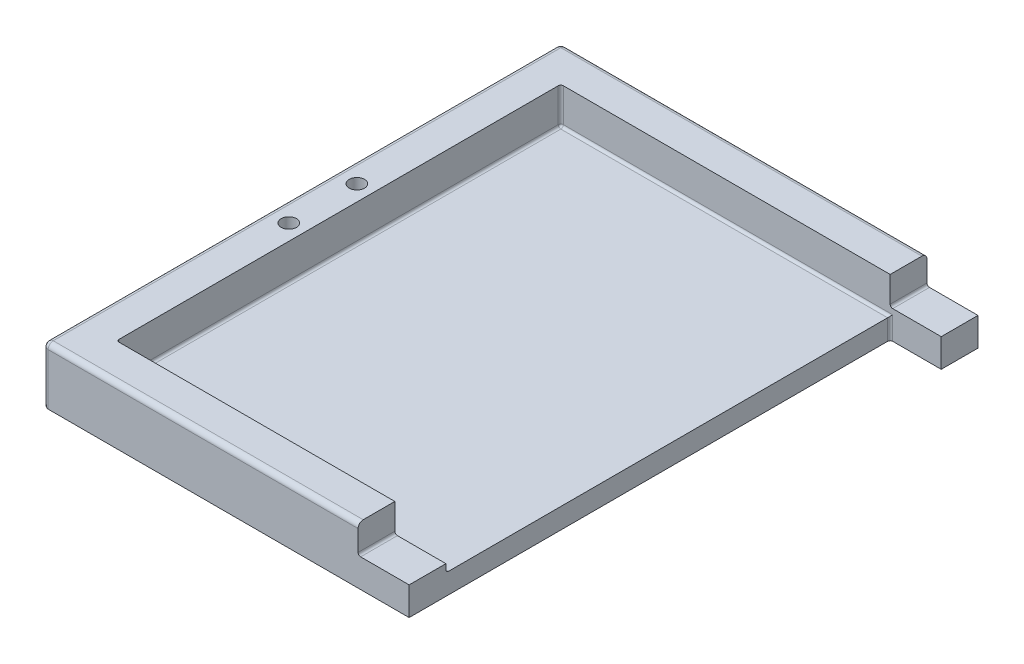
ISO-10303-21;
HEADER;
FILE_DESCRIPTION(('STEP AP214'),'2;1');
FILE_NAME('part.step','',(''),(''),'','','');
FILE_SCHEMA(('AUTOMOTIVE_DESIGN { 1 0 10303 214 1 1 1 1 }'));
ENDSEC;
DATA;
#1=APPLICATION_CONTEXT('core data for automotive mechanical design processes');
#2=APPLICATION_PROTOCOL_DEFINITION('international standard','automotive_design',2000,#1);
#3=PRODUCT_CONTEXT('',#1,'mechanical');
#4=PRODUCT('Part','Part','',(#3));
#5=PRODUCT_RELATED_PRODUCT_CATEGORY('part','',(#4));
#6=PRODUCT_DEFINITION_FORMATION('','',#4);
#7=PRODUCT_DEFINITION_CONTEXT('part definition',#1,'design');
#8=PRODUCT_DEFINITION('design','',#6,#7);
#9=PRODUCT_DEFINITION_SHAPE('','',#8);
#10=(LENGTH_UNIT() NAMED_UNIT(*) SI_UNIT(.MILLI.,.METRE.));
#11=(NAMED_UNIT(*) PLANE_ANGLE_UNIT() SI_UNIT($,.RADIAN.));
#12=(NAMED_UNIT(*) SI_UNIT($,.STERADIAN.) SOLID_ANGLE_UNIT());
#13=UNCERTAINTY_MEASURE_WITH_UNIT(LENGTH_MEASURE(1.E-05),#10,'distance_accuracy_value','');
#14=(GEOMETRIC_REPRESENTATION_CONTEXT(3) GLOBAL_UNCERTAINTY_ASSIGNED_CONTEXT((#13)) GLOBAL_UNIT_ASSIGNED_CONTEXT((#10,
#11,#12)) REPRESENTATION_CONTEXT('',''));
#15=CARTESIAN_POINT('',(0.,0.,0.));
#16=DIRECTION('',(0.,0.,1.));
#17=DIRECTION('',(1.,0.,0.));
#18=AXIS2_PLACEMENT_3D('',#15,#16,#17);
#19=CARTESIAN_POINT('',(35.85,11.1,-50.7));
#20=DIRECTION('',(1.,0.,0.));
#21=DIRECTION('',(0.,0.,-1.));
#22=AXIS2_PLACEMENT_3D('',#19,#20,#21);
#23=PLANE('',#22);
#24=DIRECTION('',(0.,0.,1.));
#25=VECTOR('',#24,1.);
#26=CARTESIAN_POINT('',(35.85,0.,-50.7));
#27=LINE('',#26,#25);
#28=CARTESIAN_POINT('',(35.85,0.,-43.));
#29=VERTEX_POINT('',#28);
#30=CARTESIAN_POINT('',(35.85,0.,50.7));
#31=VERTEX_POINT('',#30);
#32=EDGE_CURVE('E245',#29,#31,#27,.T.);
#33=ORIENTED_EDGE('',*,*,#32,.F.);
#34=DIRECTION('',(0.,-1.,0.));
#35=VECTOR('',#34,1.);
#36=CARTESIAN_POINT('',(35.85,11.1,-43.));
#37=LINE('',#36,#35);
#38=CARTESIAN_POINT('',(35.85,3.99999999999999,-43.));
#39=VERTEX_POINT('',#38);
#40=EDGE_CURVE('E249',#29,#39,#37,.F.);
#41=ORIENTED_EDGE('',*,*,#40,.T.);
#42=DIRECTION('',(0.,0.,-1.));
#43=VECTOR('',#42,1.);
#44=CARTESIAN_POINT('',(35.85,3.99999999999999,43.5));
#45=LINE('',#44,#43);
#46=CARTESIAN_POINT('',(35.85,3.99999999999999,43.));
#47=VERTEX_POINT('',#46);
#48=EDGE_CURVE('E239',#47,#39,#45,.T.);
#49=ORIENTED_EDGE('',*,*,#48,.F.);
#50=CARTESIAN_POINT('',(35.85,4.49999999999999,43.));
#51=DIRECTION('',(1.,0.,0.));
#52=DIRECTION('',(0.,0.,-1.));
#53=AXIS2_PLACEMENT_3D('',#50,#51,#52);
#54=CIRCLE('',#53,0.5);
#55=CARTESIAN_POINT('',(35.85,4.49999999999999,43.5));
#56=VERTEX_POINT('',#55);
#57=EDGE_CURVE('E12',#47,#56,#54,.F.);
#58=ORIENTED_EDGE('',*,*,#57,.T.);
#59=DIRECTION('',(0.,-1.,0.));
#60=VECTOR('',#59,1.);
#61=CARTESIAN_POINT('',(35.85,18.4615904387453,43.5));
#62=LINE('',#61,#60);
#63=CARTESIAN_POINT('',(35.85,5.55,43.5));
#64=VERTEX_POINT('',#63);
#65=EDGE_CURVE('E243',#64,#56,#62,.T.);
#66=ORIENTED_EDGE('',*,*,#65,.F.);
#67=DIRECTION('',(0.,0.,-1.));
#68=VECTOR('',#67,1.);
#69=CARTESIAN_POINT('',(35.85,5.55,52.2249307649503));
#70=LINE('',#69,#68);
#71=CARTESIAN_POINT('',(35.85,5.55,50.7));
#72=VERTEX_POINT('',#71);
#73=EDGE_CURVE('E220',#72,#64,#70,.T.);
#74=ORIENTED_EDGE('',*,*,#73,.F.);
#75=DIRECTION('',(0.,-1.,0.));
#76=VECTOR('',#75,1.);
#77=CARTESIAN_POINT('',(35.85,11.1,50.7));
#78=LINE('',#77,#76);
#79=EDGE_CURVE('E259',#72,#31,#78,.T.);
#80=ORIENTED_EDGE('',*,*,#79,.T.);
#81=EDGE_LOOP('',(#33,#41,#49,#58,#66,#74,#80));
#82=FACE_BOUND('',#81,.T.);
#83=ADVANCED_FACE('F36',(#82),#23,.T.);
#84=CARTESIAN_POINT('',(0.,11.1,0.));
#85=DIRECTION('',(0.,1.,0.));
#86=DIRECTION('',(0.,0.,1.));
#87=AXIS2_PLACEMENT_3D('',#84,#85,#86);
#88=PLANE('',#87);
#89=CARTESIAN_POINT('',(-31.75,11.1,-6.65790951));
#90=DIRECTION('',(0.,1.,0.));
#91=DIRECTION('',(0.,0.,-1.));
#92=AXIS2_PLACEMENT_3D('',#89,#90,#91);
#93=CIRCLE('',#92,1.5);
#94=CARTESIAN_POINT('',(-31.75,11.1,-8.15790951));
#95=VERTEX_POINT('',#94);
#96=EDGE_CURVE('E285',#95,#95,#93,.T.);
#97=ORIENTED_EDGE('',*,*,#96,.F.);
#98=EDGE_LOOP('',(#97));
#99=FACE_BOUND('',#98,.T.);
#100=CARTESIAN_POINT('',(-31.75,11.1,6.65790951));
#101=DIRECTION('',(0.,1.,0.));
#102=DIRECTION('',(0.,0.,1.));
#103=AXIS2_PLACEMENT_3D('',#100,#101,#102);
#104=CIRCLE('',#103,1.5);
#105=CARTESIAN_POINT('',(-31.75,11.1,8.15790951));
#106=VERTEX_POINT('',#105);
#107=EDGE_CURVE('E289',#106,#106,#104,.T.);
#108=ORIENTED_EDGE('',*,*,#107,.F.);
#109=EDGE_LOOP('',(#108));
#110=FACE_BOUND('',#109,.T.);
#111=DIRECTION('',(1.,0.,0.));
#112=VECTOR('',#111,1.);
#113=CARTESIAN_POINT('',(35.85,11.1,49.7));
#114=LINE('',#113,#112);
#115=CARTESIAN_POINT('',(-34.85,11.1,49.7));
#116=VERTEX_POINT('',#115);
#117=CARTESIAN_POINT('',(25.85,11.1,49.7));
#118=VERTEX_POINT('',#117);
#119=EDGE_CURVE('E409',#116,#118,#114,.T.);
#120=ORIENTED_EDGE('',*,*,#119,.T.);
#121=DIRECTION('',(0.,0.,1.));
#122=VECTOR('',#121,1.);
#123=CARTESIAN_POINT('',(25.85,11.1,43.5));
#124=LINE('',#123,#122);
#125=CARTESIAN_POINT('',(25.85,11.1,43.5));
#126=VERTEX_POINT('',#125);
#127=EDGE_CURVE('E224',#126,#118,#124,.T.);
#128=ORIENTED_EDGE('',*,*,#127,.F.);
#129=DIRECTION('',(1.,0.,0.));
#130=VECTOR('',#129,1.);
#131=CARTESIAN_POINT('',(0.,11.1,43.5));
#132=LINE('',#131,#130);
#133=CARTESIAN_POINT('',(-28.15,11.1,43.5));
#134=VERTEX_POINT('',#133);
#135=EDGE_CURVE('E392',#134,#126,#132,.T.);
#136=ORIENTED_EDGE('',*,*,#135,.F.);
#137=CARTESIAN_POINT('',(-28.15,11.1,43.));
#138=DIRECTION('',(0.,1.,0.));
#139=DIRECTION('',(0.,0.,1.));
#140=AXIS2_PLACEMENT_3D('',#137,#138,#139);
#141=CIRCLE('',#140,0.5);
#142=CARTESIAN_POINT('',(-28.65,11.1,43.));
#143=VERTEX_POINT('',#142);
#144=EDGE_CURVE('E45',#134,#143,#141,.F.);
#145=ORIENTED_EDGE('',*,*,#144,.T.);
#146=DIRECTION('',(0.,0.,1.));
#147=VECTOR('',#146,1.);
#148=CARTESIAN_POINT('',(-28.65,11.1,0.));
#149=LINE('',#148,#147);
#150=CARTESIAN_POINT('',(-28.65,11.1,-43.));
#151=VERTEX_POINT('',#150);
#152=EDGE_CURVE('E384',#151,#143,#149,.T.);
#153=ORIENTED_EDGE('',*,*,#152,.F.);
#154=CARTESIAN_POINT('',(-28.15,11.1,-43.));
#155=DIRECTION('',(0.,1.,0.));
#156=DIRECTION('',(0.,0.,1.));
#157=AXIS2_PLACEMENT_3D('',#154,#155,#156);
#158=CIRCLE('',#157,0.5);
#159=CARTESIAN_POINT('',(-28.15,11.1,-43.5));
#160=VERTEX_POINT('',#159);
#161=EDGE_CURVE('E344',#151,#160,#158,.F.);
#162=ORIENTED_EDGE('',*,*,#161,.T.);
#163=DIRECTION('',(-1.,0.,0.));
#164=VECTOR('',#163,1.);
#165=CARTESIAN_POINT('',(0.,11.1,-43.5));
#166=LINE('',#165,#164);
#167=CARTESIAN_POINT('',(35.85,11.1,-43.5));
#168=VERTEX_POINT('',#167);
#169=EDGE_CURVE('E393',#168,#160,#166,.T.);
#170=ORIENTED_EDGE('',*,*,#169,.F.);
#171=DIRECTION('',(0.,0.,1.));
#172=VECTOR('',#171,1.);
#173=CARTESIAN_POINT('',(35.85,11.1,-50.7));
#174=LINE('',#173,#172);
#175=CARTESIAN_POINT('',(35.85,11.1,-49.7));
#176=VERTEX_POINT('',#175);
#177=EDGE_CURVE('E256',#176,#168,#174,.T.);
#178=ORIENTED_EDGE('',*,*,#177,.F.);
#179=DIRECTION('',(1.,0.,0.));
#180=VECTOR('',#179,1.);
#181=CARTESIAN_POINT('',(0.,11.1,-49.7));
#182=LINE('',#181,#180);
#183=CARTESIAN_POINT('',(-34.85,11.1,-49.7));
#184=VERTEX_POINT('',#183);
#185=EDGE_CURVE('E413',#176,#184,#182,.F.);
#186=ORIENTED_EDGE('',*,*,#185,.T.);
#187=DIRECTION('',(0.,0.,1.));
#188=VECTOR('',#187,1.);
#189=CARTESIAN_POINT('',(-34.85,11.1,50.7));
#190=LINE('',#189,#188);
#191=EDGE_CURVE('E411',#184,#116,#190,.T.);
#192=ORIENTED_EDGE('',*,*,#191,.T.);
#193=EDGE_LOOP('',(#120,#128,#136,#145,#153,#162,#170,#178,#186,#192));
#194=FACE_BOUND('',#193,.T.);
#195=ADVANCED_FACE('F388',(#99,#110,#194),#88,.T.);
#196=CARTESIAN_POINT('',(0.,10.1,49.7));
#197=DIRECTION('',(-1.,0.,0.));
#198=DIRECTION('',(0.,0.,1.));
#199=AXIS2_PLACEMENT_3D('',#196,#197,#198);
#200=CYLINDRICAL_SURFACE('',#199,1.);
#201=DIRECTION('',(1.,0.,0.));
#202=VECTOR('',#201,1.);
#203=CARTESIAN_POINT('',(-35.85,10.1,50.7));
#204=LINE('',#203,#202);
#205=CARTESIAN_POINT('',(25.85,10.1,50.7));
#206=VERTEX_POINT('',#205);
#207=CARTESIAN_POINT('',(-34.85,10.1,50.7));
#208=VERTEX_POINT('',#207);
#209=EDGE_CURVE('E423',#206,#208,#204,.F.);
#210=ORIENTED_EDGE('',*,*,#209,.F.);
#211=CARTESIAN_POINT('',(25.85,10.1,49.7));
#212=DIRECTION('',(1.,0.,0.));
#213=DIRECTION('',(0.,0.,-1.));
#214=AXIS2_PLACEMENT_3D('',#211,#212,#213);
#215=CIRCLE('',#214,1.);
#216=EDGE_CURVE('E266',#206,#118,#215,.F.);
#217=ORIENTED_EDGE('',*,*,#216,.T.);
#218=ORIENTED_EDGE('',*,*,#119,.F.);
#219=CARTESIAN_POINT('',(-34.85,10.1,49.7));
#220=DIRECTION('',(-1.,0.,0.));
#221=DIRECTION('',(0.,0.,1.));
#222=AXIS2_PLACEMENT_3D('',#219,#220,#221);
#223=CIRCLE('',#222,1.);
#224=EDGE_CURVE('E434',#208,#116,#223,.T.);
#225=ORIENTED_EDGE('',*,*,#224,.F.);
#226=EDGE_LOOP('',(#210,#217,#218,#225));
#227=FACE_BOUND('',#226,.T.);
#228=ADVANCED_FACE('F472',(#227),#200,.T.);
#229=CARTESIAN_POINT('',(-35.85,11.1,-50.7));
#230=DIRECTION('',(1.,0.,0.));
#231=DIRECTION('',(0.,0.,-1.));
#232=AXIS2_PLACEMENT_3D('',#229,#230,#231);
#233=PLANE('',#232);
#234=DIRECTION('',(0.,0.,1.));
#235=VECTOR('',#234,1.);
#236=CARTESIAN_POINT('',(-35.85,10.1,-50.7));
#237=LINE('',#236,#235);
#238=CARTESIAN_POINT('',(-35.85,10.1,49.7));
#239=VERTEX_POINT('',#238);
#240=CARTESIAN_POINT('',(-35.85,10.1,-49.7));
#241=VERTEX_POINT('',#240);
#242=EDGE_CURVE('E400',#239,#241,#237,.F.);
#243=ORIENTED_EDGE('',*,*,#242,.T.);
#244=DIRECTION('',(0.,-1.,0.));
#245=VECTOR('',#244,1.);
#246=CARTESIAN_POINT('',(-35.85,0.,-49.7));
#247=LINE('',#246,#245);
#248=CARTESIAN_POINT('',(-35.85,0.999999999999999,-49.7));
#249=VERTEX_POINT('',#248);
#250=EDGE_CURVE('E405',#241,#249,#247,.T.);
#251=ORIENTED_EDGE('',*,*,#250,.T.);
#252=DIRECTION('',(0.,0.,1.));
#253=VECTOR('',#252,1.);
#254=CARTESIAN_POINT('',(-35.85,0.999999999999999,-50.7));
#255=LINE('',#254,#253);
#256=CARTESIAN_POINT('',(-35.85,0.999999999999999,49.7));
#257=VERTEX_POINT('',#256);
#258=EDGE_CURVE('E402',#249,#257,#255,.T.);
#259=ORIENTED_EDGE('',*,*,#258,.T.);
#260=DIRECTION('',(0.,-1.,0.));
#261=VECTOR('',#260,1.);
#262=CARTESIAN_POINT('',(-35.85,11.1,49.7));
#263=LINE('',#262,#261);
#264=EDGE_CURVE('E398',#257,#239,#263,.F.);
#265=ORIENTED_EDGE('',*,*,#264,.T.);
#266=EDGE_LOOP('',(#243,#251,#259,#265));
#267=FACE_BOUND('',#266,.T.);
#268=ADVANCED_FACE('F458',(#267),#233,.F.);
#269=CARTESIAN_POINT('',(-35.85,11.1,50.7));
#270=DIRECTION('',(0.,0.,-1.));
#271=DIRECTION('',(-1.,0.,0.));
#272=AXIS2_PLACEMENT_3D('',#269,#270,#271);
#273=PLANE('',#272);
#274=ORIENTED_EDGE('',*,*,#79,.F.);
#275=DIRECTION('',(-1.,0.,0.));
#276=VECTOR('',#275,1.);
#277=CARTESIAN_POINT('',(-35.85,5.55,50.7));
#278=LINE('',#277,#276);
#279=CARTESIAN_POINT('',(26.35,5.55,50.7));
#280=VERTEX_POINT('',#279);
#281=EDGE_CURVE('E282',#72,#280,#278,.T.);
#282=ORIENTED_EDGE('',*,*,#281,.T.);
#283=CARTESIAN_POINT('',(26.35,6.05,50.7));
#284=DIRECTION('',(0.,0.,-1.));
#285=DIRECTION('',(-1.,0.,0.));
#286=AXIS2_PLACEMENT_3D('',#283,#284,#285);
#287=CIRCLE('',#286,0.5);
#288=CARTESIAN_POINT('',(25.85,6.05,50.7));
#289=VERTEX_POINT('',#288);
#290=EDGE_CURVE('E336',#280,#289,#287,.T.);
#291=ORIENTED_EDGE('',*,*,#290,.T.);
#292=DIRECTION('',(0.,-1.,0.));
#293=VECTOR('',#292,1.);
#294=CARTESIAN_POINT('',(25.85,11.1,50.7));
#295=LINE('',#294,#293);
#296=EDGE_CURVE('E279',#206,#289,#295,.T.);
#297=ORIENTED_EDGE('',*,*,#296,.F.);
#298=ORIENTED_EDGE('',*,*,#209,.T.);
#299=DIRECTION('',(0.,-1.,0.));
#300=VECTOR('',#299,1.);
#301=CARTESIAN_POINT('',(-34.85,11.1,50.7));
#302=LINE('',#301,#300);
#303=CARTESIAN_POINT('',(-34.85,0.,50.7));
#304=VERTEX_POINT('',#303);
#305=EDGE_CURVE('E421',#208,#304,#302,.T.);
#306=ORIENTED_EDGE('',*,*,#305,.T.);
#307=DIRECTION('',(1.,0.,0.));
#308=VECTOR('',#307,1.);
#309=CARTESIAN_POINT('',(-35.85,0.,50.7));
#310=LINE('',#309,#308);
#311=EDGE_CURVE('E248',#304,#31,#310,.T.);
#312=ORIENTED_EDGE('',*,*,#311,.T.);
#313=EDGE_LOOP('',(#274,#282,#291,#297,#298,#306,#312));
#314=FACE_BOUND('',#313,.T.);
#315=ADVANCED_FACE('F508',(#314),#273,.F.);
#316=DIRECTION('',(0.,1.,0.));
#317=VECTOR('',#316,1.);
#318=CARTESIAN_POINT('',(35.85,18.4615904387453,-43.5));
#319=LINE('',#318,#317);
#320=CARTESIAN_POINT('',(35.85,6.05,-43.5));
#321=VERTEX_POINT('',#320);
#322=EDGE_CURVE('E242',#321,#168,#319,.T.);
#323=ORIENTED_EDGE('',*,*,#322,.F.);
#324=DIRECTION('',(0.,0.,1.));
#325=VECTOR('',#324,1.);
#326=CARTESIAN_POINT('',(35.85,6.05,-50.7));
#327=LINE('',#326,#325);
#328=CARTESIAN_POINT('',(35.85,6.05,-50.7));
#329=VERTEX_POINT('',#328);
#330=EDGE_CURVE('E306',#321,#329,#327,.F.);
#331=ORIENTED_EDGE('',*,*,#330,.T.);
#332=DIRECTION('',(0.,-1.,0.));
#333=VECTOR('',#332,1.);
#334=CARTESIAN_POINT('',(35.85,11.1,-50.7));
#335=LINE('',#334,#333);
#336=CARTESIAN_POINT('',(35.85,10.1,-50.7));
#337=VERTEX_POINT('',#336);
#338=EDGE_CURVE('E262',#337,#329,#335,.T.);
#339=ORIENTED_EDGE('',*,*,#338,.F.);
#340=CARTESIAN_POINT('',(35.85,10.1,-49.7));
#341=DIRECTION('',(1.,0.,0.));
#342=DIRECTION('',(0.,0.,-1.));
#343=AXIS2_PLACEMENT_3D('',#340,#341,#342);
#344=CIRCLE('',#343,1.);
#345=EDGE_CURVE('E419',#337,#176,#344,.T.);
#346=ORIENTED_EDGE('',*,*,#345,.T.);
#347=ORIENTED_EDGE('',*,*,#177,.T.);
#348=EDGE_LOOP('',(#323,#331,#339,#346,#347));
#349=FACE_BOUND('',#348,.T.);
#350=ADVANCED_FACE('F495',(#349),#23,.T.);
#351=CARTESIAN_POINT('',(-35.85,11.1,-50.7));
#352=DIRECTION('',(0.,0.,-1.));
#353=DIRECTION('',(-1.,0.,0.));
#354=AXIS2_PLACEMENT_3D('',#351,#352,#353);
#355=PLANE('',#354);
#356=DIRECTION('',(0.,-1.,0.));
#357=VECTOR('',#356,1.);
#358=CARTESIAN_POINT('',(-34.85,11.1,-50.7));
#359=LINE('',#358,#357);
#360=CARTESIAN_POINT('',(-34.85,0.,-50.7));
#361=VERTEX_POINT('',#360);
#362=CARTESIAN_POINT('',(-34.85,10.1,-50.7));
#363=VERTEX_POINT('',#362);
#364=EDGE_CURVE('E415',#361,#363,#359,.F.);
#365=ORIENTED_EDGE('',*,*,#364,.T.);
#366=DIRECTION('',(1.,0.,0.));
#367=VECTOR('',#366,1.);
#368=CARTESIAN_POINT('',(-35.85,10.1,-50.7));
#369=LINE('',#368,#367);
#370=EDGE_CURVE('E417',#363,#337,#369,.T.);
#371=ORIENTED_EDGE('',*,*,#370,.T.);
#372=ORIENTED_EDGE('',*,*,#338,.T.);
#373=CARTESIAN_POINT('',(36.35,6.05,-50.7));
#374=DIRECTION('',(0.,0.,-1.));
#375=DIRECTION('',(-1.,0.,0.));
#376=AXIS2_PLACEMENT_3D('',#373,#374,#375);
#377=CIRCLE('',#376,0.5);
#378=CARTESIAN_POINT('',(36.35,5.55,-50.7));
#379=VERTEX_POINT('',#378);
#380=EDGE_CURVE('E340',#329,#379,#377,.F.);
#381=ORIENTED_EDGE('',*,*,#380,.T.);
#382=DIRECTION('',(-1.,0.,0.));
#383=VECTOR('',#382,1.);
#384=CARTESIAN_POINT('',(45.85,5.55,-50.7));
#385=LINE('',#384,#383);
#386=CARTESIAN_POINT('',(45.85,5.55,-50.7));
#387=VERTEX_POINT('',#386);
#388=EDGE_CURVE('E221',#387,#379,#385,.T.);
#389=ORIENTED_EDGE('',*,*,#388,.F.);
#390=DIRECTION('',(0.,1.,0.));
#391=VECTOR('',#390,1.);
#392=CARTESIAN_POINT('',(45.85,5.55,-50.7));
#393=LINE('',#392,#391);
#394=CARTESIAN_POINT('',(45.85,0.,-50.7));
#395=VERTEX_POINT('',#394);
#396=EDGE_CURVE('E205',#395,#387,#393,.T.);
#397=ORIENTED_EDGE('',*,*,#396,.F.);
#398=DIRECTION('',(1.,0.,0.));
#399=VECTOR('',#398,1.);
#400=CARTESIAN_POINT('',(-35.85,0.,-50.7));
#401=LINE('',#400,#399);
#402=EDGE_CURVE('E202',#361,#395,#401,.T.);
#403=ORIENTED_EDGE('',*,*,#402,.F.);
#404=EDGE_LOOP('',(#365,#371,#372,#381,#389,#397,#403));
#405=FACE_BOUND('',#404,.T.);
#406=ADVANCED_FACE('F500',(#405),#355,.T.);
#407=CARTESIAN_POINT('',(0.,0.,0.));
#408=DIRECTION('',(0.,1.,0.));
#409=DIRECTION('',(0.,0.,1.));
#410=AXIS2_PLACEMENT_3D('',#407,#408,#409);
#411=PLANE('',#410);
#412=ORIENTED_EDGE('',*,*,#311,.F.);
#413=DIRECTION('',(0.,0.,1.));
#414=VECTOR('',#413,1.);
#415=CARTESIAN_POINT('',(-34.85,0.,0.));
#416=LINE('',#415,#414);
#417=EDGE_CURVE('E407',#304,#361,#416,.F.);
#418=ORIENTED_EDGE('',*,*,#417,.T.);
#419=ORIENTED_EDGE('',*,*,#402,.T.);
#420=DIRECTION('',(0.,0.,-1.));
#421=VECTOR('',#420,1.);
#422=CARTESIAN_POINT('',(45.85,0.,-43.5));
#423=LINE('',#422,#421);
#424=CARTESIAN_POINT('',(45.85,0.,-43.5));
#425=VERTEX_POINT('',#424);
#426=EDGE_CURVE('E194',#425,#395,#423,.T.);
#427=ORIENTED_EDGE('',*,*,#426,.F.);
#428=DIRECTION('',(-1.,0.,0.));
#429=VECTOR('',#428,1.);
#430=CARTESIAN_POINT('',(45.85,0.,-43.5));
#431=LINE('',#430,#429);
#432=CARTESIAN_POINT('',(36.35,0.,-43.5));
#433=VERTEX_POINT('',#432);
#434=EDGE_CURVE('E199',#425,#433,#431,.T.);
#435=ORIENTED_EDGE('',*,*,#434,.T.);
#436=CARTESIAN_POINT('',(36.35,0.,-43.));
#437=DIRECTION('',(0.,1.,0.));
#438=DIRECTION('',(0.,0.,1.));
#439=AXIS2_PLACEMENT_3D('',#436,#437,#438);
#440=CIRCLE('',#439,0.5);
#441=EDGE_CURVE('E342',#433,#29,#440,.T.);
#442=ORIENTED_EDGE('',*,*,#441,.T.);
#443=ORIENTED_EDGE('',*,*,#32,.T.);
#444=EDGE_LOOP('',(#412,#418,#419,#427,#435,#442,#443));
#445=FACE_BOUND('',#444,.T.);
#446=ADVANCED_FACE('F197',(#445),#411,.F.);
#447=CARTESIAN_POINT('',(-28.65,18.4615904387453,-43.5));
#448=DIRECTION('',(0.,0.,-1.));
#449=DIRECTION('',(0.,1.,0.));
#450=AXIS2_PLACEMENT_3D('',#447,#448,#449);
#451=PLANE('',#450);
#452=DIRECTION('',(1.,0.,0.));
#453=VECTOR('',#452,1.);
#454=CARTESIAN_POINT('',(35.85,4.49999999999999,-43.5));
#455=LINE('',#454,#453);
#456=CARTESIAN_POINT('',(-28.15,4.49999999999999,-43.5));
#457=VERTEX_POINT('',#456);
#458=CARTESIAN_POINT('',(36.35,4.49999999999999,-43.5));
#459=VERTEX_POINT('',#458);
#460=EDGE_CURVE('E308',#457,#459,#455,.T.);
#461=ORIENTED_EDGE('',*,*,#460,.T.);
#462=DIRECTION('',(0.,-1.,0.));
#463=VECTOR('',#462,1.);
#464=CARTESIAN_POINT('',(36.35,18.4615904387453,-43.5));
#465=LINE('',#464,#463);
#466=EDGE_CURVE('E219',#459,#433,#465,.T.);
#467=ORIENTED_EDGE('',*,*,#466,.T.);
#468=ORIENTED_EDGE('',*,*,#434,.F.);
#469=DIRECTION('',(0.,-1.,0.));
#470=VECTOR('',#469,1.);
#471=CARTESIAN_POINT('',(45.85,5.55,-43.5));
#472=LINE('',#471,#470);
#473=CARTESIAN_POINT('',(45.85,5.55,-43.5));
#474=VERTEX_POINT('',#473);
#475=EDGE_CURVE('E206',#474,#425,#472,.T.);
#476=ORIENTED_EDGE('',*,*,#475,.F.);
#477=DIRECTION('',(-1.,0.,0.));
#478=VECTOR('',#477,1.);
#479=CARTESIAN_POINT('',(45.85,5.55,-43.5));
#480=LINE('',#479,#478);
#481=CARTESIAN_POINT('',(36.35,5.55,-43.5));
#482=VERTEX_POINT('',#481);
#483=EDGE_CURVE('E227',#474,#482,#480,.T.);
#484=ORIENTED_EDGE('',*,*,#483,.T.);
#485=CARTESIAN_POINT('',(36.35,6.05,-43.5));
#486=DIRECTION('',(0.,0.,-1.));
#487=DIRECTION('',(0.,1.,0.));
#488=AXIS2_PLACEMENT_3D('',#485,#486,#487);
#489=CIRCLE('',#488,0.5);
#490=EDGE_CURVE('E338',#482,#321,#489,.T.);
#491=ORIENTED_EDGE('',*,*,#490,.T.);
#492=ORIENTED_EDGE('',*,*,#322,.T.);
#493=ORIENTED_EDGE('',*,*,#169,.T.);
#494=DIRECTION('',(0.,1.,0.));
#495=VECTOR('',#494,1.);
#496=CARTESIAN_POINT('',(-28.15,3.99999999999999,-43.5));
#497=LINE('',#496,#495);
#498=EDGE_CURVE('E309',#160,#457,#497,.F.);
#499=ORIENTED_EDGE('',*,*,#498,.T.);
#500=EDGE_LOOP('',(#461,#467,#468,#476,#484,#491,#492,#493,#499));
#501=FACE_BOUND('',#500,.T.);
#502=ADVANCED_FACE('F217',(#501),#451,.F.);
#503=CARTESIAN_POINT('',(-28.65,3.99999999999999,43.5));
#504=DIRECTION('',(0.,-1.,0.));
#505=DIRECTION('',(0.,0.,-1.));
#506=AXIS2_PLACEMENT_3D('',#503,#504,#505);
#507=PLANE('',#506);
#508=ORIENTED_EDGE('',*,*,#48,.T.);
#509=DIRECTION('',(1.,0.,0.));
#510=VECTOR('',#509,1.);
#511=CARTESIAN_POINT('',(-28.65,3.99999999999999,-43.));
#512=LINE('',#511,#510);
#513=CARTESIAN_POINT('',(-28.15,3.99999999999999,-43.));
#514=VERTEX_POINT('',#513);
#515=EDGE_CURVE('E53',#39,#514,#512,.F.);
#516=ORIENTED_EDGE('',*,*,#515,.T.);
#517=DIRECTION('',(0.,0.,-1.));
#518=VECTOR('',#517,1.);
#519=CARTESIAN_POINT('',(-28.15,3.99999999999999,43.5));
#520=LINE('',#519,#518);
#521=CARTESIAN_POINT('',(-28.15,3.99999999999999,43.));
#522=VERTEX_POINT('',#521);
#523=EDGE_CURVE('E57',#514,#522,#520,.F.);
#524=ORIENTED_EDGE('',*,*,#523,.T.);
#525=DIRECTION('',(1.,0.,0.));
#526=VECTOR('',#525,1.);
#527=CARTESIAN_POINT('',(35.85,3.99999999999999,43.));
#528=LINE('',#527,#526);
#529=EDGE_CURVE('E330',#522,#47,#528,.T.);
#530=ORIENTED_EDGE('',*,*,#529,.T.);
#531=EDGE_LOOP('',(#508,#516,#524,#530));
#532=FACE_BOUND('',#531,.T.);
#533=ADVANCED_FACE('F583',(#532),#507,.F.);
#534=CARTESIAN_POINT('',(-28.65,18.4615904387453,43.5));
#535=DIRECTION('',(0.,0.,1.));
#536=DIRECTION('',(1.,0.,0.));
#537=AXIS2_PLACEMENT_3D('',#534,#535,#536);
#538=PLANE('',#537);
#539=DIRECTION('',(1.,0.,0.));
#540=VECTOR('',#539,1.);
#541=CARTESIAN_POINT('',(-28.65,4.49999999999999,43.5));
#542=LINE('',#541,#540);
#543=CARTESIAN_POINT('',(-28.15,4.49999999999999,43.5));
#544=VERTEX_POINT('',#543);
#545=EDGE_CURVE('E326',#56,#544,#542,.F.);
#546=ORIENTED_EDGE('',*,*,#545,.T.);
#547=DIRECTION('',(0.,-1.,0.));
#548=VECTOR('',#547,1.);
#549=CARTESIAN_POINT('',(-28.15,11.1,43.5));
#550=LINE('',#549,#548);
#551=EDGE_CURVE('E328',#544,#134,#550,.F.);
#552=ORIENTED_EDGE('',*,*,#551,.T.);
#553=ORIENTED_EDGE('',*,*,#135,.T.);
#554=DIRECTION('',(0.,1.,0.));
#555=VECTOR('',#554,1.);
#556=CARTESIAN_POINT('',(25.85,5.55,43.5));
#557=LINE('',#556,#555);
#558=CARTESIAN_POINT('',(25.85,6.05,43.5));
#559=VERTEX_POINT('',#558);
#560=EDGE_CURVE('E274',#559,#126,#557,.T.);
#561=ORIENTED_EDGE('',*,*,#560,.F.);
#562=CARTESIAN_POINT('',(26.35,6.05,43.5));
#563=DIRECTION('',(0.,0.,1.));
#564=DIRECTION('',(1.,0.,0.));
#565=AXIS2_PLACEMENT_3D('',#562,#563,#564);
#566=CIRCLE('',#565,0.5);
#567=CARTESIAN_POINT('',(26.35,5.55,43.5));
#568=VERTEX_POINT('',#567);
#569=EDGE_CURVE('E334',#559,#568,#566,.T.);
#570=ORIENTED_EDGE('',*,*,#569,.T.);
#571=DIRECTION('',(1.,0.,0.));
#572=VECTOR('',#571,1.);
#573=CARTESIAN_POINT('',(25.85,5.55,43.5));
#574=LINE('',#573,#572);
#575=EDGE_CURVE('E276',#568,#64,#574,.T.);
#576=ORIENTED_EDGE('',*,*,#575,.T.);
#577=ORIENTED_EDGE('',*,*,#65,.T.);
#578=EDGE_LOOP('',(#546,#552,#553,#561,#570,#576,#577));
#579=FACE_BOUND('',#578,.T.);
#580=ADVANCED_FACE('F574',(#579),#538,.F.);
#581=CARTESIAN_POINT('',(-28.65,0.,0.));
#582=DIRECTION('',(-1.,0.,0.));
#583=DIRECTION('',(0.,0.,1.));
#584=AXIS2_PLACEMENT_3D('',#581,#582,#583);
#585=PLANE('',#584);
#586=DIRECTION('',(0.,0.,-1.));
#587=VECTOR('',#586,1.);
#588=CARTESIAN_POINT('',(-28.65,4.49999999999999,-43.5));
#589=LINE('',#588,#587);
#590=CARTESIAN_POINT('',(-28.65,4.49999999999999,43.));
#591=VERTEX_POINT('',#590);
#592=CARTESIAN_POINT('',(-28.65,4.49999999999999,-43.));
#593=VERTEX_POINT('',#592);
#594=EDGE_CURVE('E313',#591,#593,#589,.T.);
#595=ORIENTED_EDGE('',*,*,#594,.T.);
#596=DIRECTION('',(0.,1.,0.));
#597=VECTOR('',#596,1.);
#598=CARTESIAN_POINT('',(-28.65,11.1,-43.));
#599=LINE('',#598,#597);
#600=EDGE_CURVE('E322',#593,#151,#599,.T.);
#601=ORIENTED_EDGE('',*,*,#600,.T.);
#602=ORIENTED_EDGE('',*,*,#152,.T.);
#603=DIRECTION('',(0.,-1.,0.));
#604=VECTOR('',#603,1.);
#605=CARTESIAN_POINT('',(-28.65,3.99999999999999,43.));
#606=LINE('',#605,#604);
#607=EDGE_CURVE('E318',#143,#591,#606,.T.);
#608=ORIENTED_EDGE('',*,*,#607,.T.);
#609=EDGE_LOOP('',(#595,#601,#602,#608));
#610=FACE_BOUND('',#609,.T.);
#611=ADVANCED_FACE('F383',(#610),#585,.F.);
#612=CARTESIAN_POINT('',(-35.85,10.1,-49.7));
#613=DIRECTION('',(1.,0.,0.));
#614=DIRECTION('',(0.,0.,-1.));
#615=AXIS2_PLACEMENT_3D('',#612,#613,#614);
#616=CYLINDRICAL_SURFACE('',#615,1.);
#617=ORIENTED_EDGE('',*,*,#345,.F.);
#618=ORIENTED_EDGE('',*,*,#370,.F.);
#619=CARTESIAN_POINT('',(-34.85,10.1,-49.7));
#620=DIRECTION('',(-1.,0.,0.));
#621=DIRECTION('',(0.,0.,1.));
#622=AXIS2_PLACEMENT_3D('',#619,#620,#621);
#623=CIRCLE('',#622,1.);
#624=EDGE_CURVE('E300',#184,#363,#623,.T.);
#625=ORIENTED_EDGE('',*,*,#624,.F.);
#626=ORIENTED_EDGE('',*,*,#185,.F.);
#627=EDGE_LOOP('',(#617,#618,#625,#626));
#628=FACE_BOUND('',#627,.T.);
#629=ADVANCED_FACE('F498',(#628),#616,.T.);
#630=CARTESIAN_POINT('',(-34.85,10.1,0.));
#631=DIRECTION('',(0.,0.,-1.));
#632=DIRECTION('',(-1.,0.,0.));
#633=AXIS2_PLACEMENT_3D('',#630,#631,#632);
#634=CYLINDRICAL_SURFACE('',#633,1.);
#635=CARTESIAN_POINT('',(-34.85,10.1,49.7));
#636=DIRECTION('',(0.,0.,1.));
#637=DIRECTION('',(1.,0.,0.));
#638=AXIS2_PLACEMENT_3D('',#635,#636,#637);
#639=CIRCLE('',#638,1.);
#640=EDGE_CURVE('E437',#116,#239,#639,.T.);
#641=ORIENTED_EDGE('',*,*,#640,.F.);
#642=ORIENTED_EDGE('',*,*,#191,.F.);
#643=CARTESIAN_POINT('',(-34.85,10.1,-49.7));
#644=DIRECTION('',(0.,0.,-1.));
#645=DIRECTION('',(-1.,0.,0.));
#646=AXIS2_PLACEMENT_3D('',#643,#644,#645);
#647=CIRCLE('',#646,1.);
#648=EDGE_CURVE('E440',#241,#184,#647,.T.);
#649=ORIENTED_EDGE('',*,*,#648,.F.);
#650=ORIENTED_EDGE('',*,*,#242,.F.);
#651=EDGE_LOOP('',(#641,#642,#649,#650));
#652=FACE_BOUND('',#651,.T.);
#653=ADVANCED_FACE('F464',(#652),#634,.T.);
#654=CARTESIAN_POINT('',(-34.85,10.1,-49.7));
#655=DIRECTION('',(0.,0.,1.));
#656=DIRECTION('',(1.,0.,0.));
#657=AXIS2_PLACEMENT_3D('',#654,#655,#656);
#658=SPHERICAL_SURFACE('',#657,1.);
#659=ORIENTED_EDGE('',*,*,#648,.T.);
#660=ORIENTED_EDGE('',*,*,#624,.T.);
#661=CARTESIAN_POINT('',(-34.85,10.1,-49.7));
#662=DIRECTION('',(0.,1.,0.));
#663=DIRECTION('',(0.,0.,1.));
#664=AXIS2_PLACEMENT_3D('',#661,#662,#663);
#665=CIRCLE('',#664,1.);
#666=EDGE_CURVE('E431',#241,#363,#665,.F.);
#667=ORIENTED_EDGE('',*,*,#666,.F.);
#668=EDGE_LOOP('',(#659,#660,#667));
#669=FACE_BOUND('',#668,.T.);
#670=ADVANCED_FACE('F446',(#669),#658,.T.);
#671=CARTESIAN_POINT('',(-34.85,10.1,49.7));
#672=DIRECTION('',(0.,0.,1.));
#673=DIRECTION('',(1.,0.,0.));
#674=AXIS2_PLACEMENT_3D('',#671,#672,#673);
#675=SPHERICAL_SURFACE('',#674,1.);
#676=ORIENTED_EDGE('',*,*,#224,.T.);
#677=ORIENTED_EDGE('',*,*,#640,.T.);
#678=CARTESIAN_POINT('',(-34.85,10.1,49.7));
#679=DIRECTION('',(0.,1.,0.));
#680=DIRECTION('',(0.,0.,1.));
#681=AXIS2_PLACEMENT_3D('',#678,#679,#680);
#682=CIRCLE('',#681,1.);
#683=EDGE_CURVE('E428',#208,#239,#682,.F.);
#684=ORIENTED_EDGE('',*,*,#683,.F.);
#685=EDGE_LOOP('',(#676,#677,#684));
#686=FACE_BOUND('',#685,.T.);
#687=ADVANCED_FACE('F533',(#686),#675,.T.);
#688=CARTESIAN_POINT('',(-34.85,11.1,-49.7));
#689=DIRECTION('',(0.,1.,0.));
#690=DIRECTION('',(0.,0.,1.));
#691=AXIS2_PLACEMENT_3D('',#688,#689,#690);
#692=CYLINDRICAL_SURFACE('',#691,1.);
#693=ORIENTED_EDGE('',*,*,#666,.T.);
#694=ORIENTED_EDGE('',*,*,#364,.F.);
#695=CARTESIAN_POINT('',(-34.85,0.999999999999999,-49.7));
#696=DIRECTION('',(0.,0.707106781186547,-0.707106781186547));
#697=DIRECTION('',(0.,0.707106781186547,0.707106781186547));
#698=AXIS2_PLACEMENT_3D('',#695,#696,#697);
#699=ELLIPSE('',#698,1.41421356237309,1.);
#700=EDGE_CURVE('E426',#249,#361,#699,.F.);
#701=ORIENTED_EDGE('',*,*,#700,.F.);
#702=ORIENTED_EDGE('',*,*,#250,.F.);
#703=EDGE_LOOP('',(#693,#694,#701,#702));
#704=FACE_BOUND('',#703,.T.);
#705=ADVANCED_FACE('F454',(#704),#692,.T.);
#706=CARTESIAN_POINT('',(-34.85,11.1,49.7));
#707=DIRECTION('',(0.,-1.,0.));
#708=DIRECTION('',(0.,0.,-1.));
#709=AXIS2_PLACEMENT_3D('',#706,#707,#708);
#710=CYLINDRICAL_SURFACE('',#709,1.);
#711=ORIENTED_EDGE('',*,*,#683,.T.);
#712=ORIENTED_EDGE('',*,*,#264,.F.);
#713=CARTESIAN_POINT('',(-34.85,0.999999999999999,49.7));
#714=DIRECTION('',(0.,-0.707106781186547,-0.707106781186547));
#715=DIRECTION('',(0.,-0.707106781186547,0.707106781186547));
#716=AXIS2_PLACEMENT_3D('',#713,#714,#715);
#717=ELLIPSE('',#716,1.41421356237309,1.);
#718=EDGE_CURVE('E295',#304,#257,#717,.T.);
#719=ORIENTED_EDGE('',*,*,#718,.F.);
#720=ORIENTED_EDGE('',*,*,#305,.F.);
#721=EDGE_LOOP('',(#711,#712,#719,#720));
#722=FACE_BOUND('',#721,.T.);
#723=ADVANCED_FACE('F526',(#722),#710,.T.);
#724=CARTESIAN_POINT('',(-34.85,0.999999999999999,-50.7));
#725=DIRECTION('',(0.,0.,1.));
#726=DIRECTION('',(1.,0.,0.));
#727=AXIS2_PLACEMENT_3D('',#724,#725,#726);
#728=CYLINDRICAL_SURFACE('',#727,1.);
#729=ORIENTED_EDGE('',*,*,#700,.T.);
#730=ORIENTED_EDGE('',*,*,#417,.F.);
#731=ORIENTED_EDGE('',*,*,#718,.T.);
#732=ORIENTED_EDGE('',*,*,#258,.F.);
#733=EDGE_LOOP('',(#729,#730,#731,#732));
#734=FACE_BOUND('',#733,.T.);
#735=ADVANCED_FACE('F522',(#734),#728,.T.);
#736=CARTESIAN_POINT('',(-31.75,7.1,6.65790951));
#737=DIRECTION('',(0.,1.,0.));
#738=DIRECTION('',(0.,0.,1.));
#739=AXIS2_PLACEMENT_3D('',#736,#737,#738);
#740=CYLINDRICAL_SURFACE('',#739,1.5);
#741=CARTESIAN_POINT('',(-31.75,7.1,6.65790951));
#742=DIRECTION('',(0.,1.,0.));
#743=DIRECTION('',(0.,0.,1.));
#744=AXIS2_PLACEMENT_3D('',#741,#742,#743);
#745=CIRCLE('',#744,1.5);
#746=CARTESIAN_POINT('',(-31.75,7.1,8.15790951));
#747=VERTEX_POINT('',#746);
#748=EDGE_CURVE('E292',#747,#747,#745,.T.);
#749=ORIENTED_EDGE('',*,*,#748,.F.);
#750=EDGE_LOOP('',(#749));
#751=FACE_BOUND('',#750,.T.);
#752=ORIENTED_EDGE('',*,*,#107,.T.);
#753=EDGE_LOOP('',(#752));
#754=FACE_BOUND('',#753,.T.);
#755=ADVANCED_FACE('F525',(#751,#754),#740,.F.);
#756=CARTESIAN_POINT('',(-31.75,7.1,6.65790951));
#757=DIRECTION('',(0.,1.,0.));
#758=DIRECTION('',(0.,0.,1.));
#759=AXIS2_PLACEMENT_3D('',#756,#757,#758);
#760=PLANE('',#759);
#761=ORIENTED_EDGE('',*,*,#748,.T.);
#762=EDGE_LOOP('',(#761));
#763=FACE_BOUND('',#762,.T.);
#764=ADVANCED_FACE('F601',(#763),#760,.T.);
#765=CARTESIAN_POINT('',(-31.75,7.1,-6.65790951));
#766=DIRECTION('',(0.,1.,0.));
#767=DIRECTION('',(0.,0.,1.));
#768=AXIS2_PLACEMENT_3D('',#765,#766,#767);
#769=CYLINDRICAL_SURFACE('',#768,1.5);
#770=CARTESIAN_POINT('',(-31.75,7.1,-6.65790951));
#771=DIRECTION('',(0.,1.,0.));
#772=DIRECTION('',(0.,0.,-1.));
#773=AXIS2_PLACEMENT_3D('',#770,#771,#772);
#774=CIRCLE('',#773,1.5);
#775=CARTESIAN_POINT('',(-31.75,7.1,-8.15790951));
#776=VERTEX_POINT('',#775);
#777=EDGE_CURVE('E286',#776,#776,#774,.T.);
#778=ORIENTED_EDGE('',*,*,#777,.F.);
#779=EDGE_LOOP('',(#778));
#780=FACE_BOUND('',#779,.T.);
#781=ORIENTED_EDGE('',*,*,#96,.T.);
#782=EDGE_LOOP('',(#781));
#783=FACE_BOUND('',#782,.T.);
#784=ADVANCED_FACE('F605',(#780,#783),#769,.F.);
#785=CARTESIAN_POINT('',(-31.75,7.1,-6.65790951));
#786=DIRECTION('',(0.,-1.,0.));
#787=DIRECTION('',(0.,0.,-1.));
#788=AXIS2_PLACEMENT_3D('',#785,#786,#787);
#789=PLANE('',#788);
#790=ORIENTED_EDGE('',*,*,#777,.T.);
#791=EDGE_LOOP('',(#790));
#792=FACE_BOUND('',#791,.T.);
#793=ADVANCED_FACE('F609',(#792),#789,.F.);
#794=CARTESIAN_POINT('',(25.85,5.55,52.2249307649503));
#795=DIRECTION('',(0.,-1.,0.));
#796=DIRECTION('',(0.,0.,-1.));
#797=AXIS2_PLACEMENT_3D('',#794,#795,#796);
#798=PLANE('',#797);
#799=ORIENTED_EDGE('',*,*,#575,.F.);
#800=DIRECTION('',(0.,0.,-1.));
#801=VECTOR('',#800,1.);
#802=CARTESIAN_POINT('',(26.35,5.55,52.2249307649503));
#803=LINE('',#802,#801);
#804=EDGE_CURVE('E477',#568,#280,#803,.F.);
#805=ORIENTED_EDGE('',*,*,#804,.T.);
#806=ORIENTED_EDGE('',*,*,#281,.F.);
#807=ORIENTED_EDGE('',*,*,#73,.T.);
#808=EDGE_LOOP('',(#799,#805,#806,#807));
#809=FACE_BOUND('',#808,.T.);
#810=ADVANCED_FACE('F576',(#809),#798,.F.);
#811=CARTESIAN_POINT('',(25.85,0.,0.));
#812=DIRECTION('',(1.,0.,0.));
#813=DIRECTION('',(0.,0.,-1.));
#814=AXIS2_PLACEMENT_3D('',#811,#812,#813);
#815=PLANE('',#814);
#816=ORIENTED_EDGE('',*,*,#296,.T.);
#817=DIRECTION('',(0.,0.,-1.));
#818=VECTOR('',#817,1.);
#819=CARTESIAN_POINT('',(25.85,6.05,0.));
#820=LINE('',#819,#818);
#821=EDGE_CURVE('E236',#289,#559,#820,.T.);
#822=ORIENTED_EDGE('',*,*,#821,.T.);
#823=ORIENTED_EDGE('',*,*,#560,.T.);
#824=ORIENTED_EDGE('',*,*,#127,.T.);
#825=ORIENTED_EDGE('',*,*,#216,.F.);
#826=EDGE_LOOP('',(#816,#822,#823,#824,#825));
#827=FACE_BOUND('',#826,.T.);
#828=ADVANCED_FACE('F575',(#827),#815,.T.);
#829=CARTESIAN_POINT('',(45.85,5.55,-43.5));
#830=DIRECTION('',(0.,-1.,0.));
#831=DIRECTION('',(0.,0.,-1.));
#832=AXIS2_PLACEMENT_3D('',#829,#830,#831);
#833=PLANE('',#832);
#834=ORIENTED_EDGE('',*,*,#388,.T.);
#835=DIRECTION('',(0.,0.,1.));
#836=VECTOR('',#835,1.);
#837=CARTESIAN_POINT('',(36.35,5.55,-43.5));
#838=LINE('',#837,#836);
#839=EDGE_CURVE('E305',#379,#482,#838,.T.);
#840=ORIENTED_EDGE('',*,*,#839,.T.);
#841=ORIENTED_EDGE('',*,*,#483,.F.);
#842=DIRECTION('',(0.,0.,1.));
#843=VECTOR('',#842,1.);
#844=CARTESIAN_POINT('',(45.85,5.55,-43.5));
#845=LINE('',#844,#843);
#846=EDGE_CURVE('E211',#387,#474,#845,.T.);
#847=ORIENTED_EDGE('',*,*,#846,.F.);
#848=EDGE_LOOP('',(#834,#840,#841,#847));
#849=FACE_BOUND('',#848,.T.);
#850=ADVANCED_FACE('F486',(#849),#833,.F.);
#851=CARTESIAN_POINT('',(45.85,0.,0.));
#852=DIRECTION('',(1.,0.,0.));
#853=DIRECTION('',(0.,0.,-1.));
#854=AXIS2_PLACEMENT_3D('',#851,#852,#853);
#855=PLANE('',#854);
#856=ORIENTED_EDGE('',*,*,#475,.T.);
#857=ORIENTED_EDGE('',*,*,#426,.T.);
#858=ORIENTED_EDGE('',*,*,#396,.T.);
#859=ORIENTED_EDGE('',*,*,#846,.T.);
#860=EDGE_LOOP('',(#856,#857,#858,#859));
#861=FACE_BOUND('',#860,.T.);
#862=ADVANCED_FACE('F209',(#861),#855,.T.);
#863=CARTESIAN_POINT('',(26.35,6.05,0.));
#864=DIRECTION('',(0.,0.,-1.));
#865=DIRECTION('',(-1.,0.,0.));
#866=AXIS2_PLACEMENT_3D('',#863,#864,#865);
#867=CYLINDRICAL_SURFACE('',#866,0.5);
#868=ORIENTED_EDGE('',*,*,#290,.F.);
#869=ORIENTED_EDGE('',*,*,#804,.F.);
#870=ORIENTED_EDGE('',*,*,#569,.F.);
#871=ORIENTED_EDGE('',*,*,#821,.F.);
#872=EDGE_LOOP('',(#868,#869,#870,#871));
#873=FACE_BOUND('',#872,.T.);
#874=ADVANCED_FACE('F545',(#873),#867,.F.);
#875=CARTESIAN_POINT('',(36.35,6.05,-43.5));
#876=DIRECTION('',(0.,0.,1.));
#877=DIRECTION('',(1.,0.,0.));
#878=AXIS2_PLACEMENT_3D('',#875,#876,#877);
#879=CYLINDRICAL_SURFACE('',#878,0.5);
#880=ORIENTED_EDGE('',*,*,#380,.F.);
#881=ORIENTED_EDGE('',*,*,#330,.F.);
#882=ORIENTED_EDGE('',*,*,#490,.F.);
#883=ORIENTED_EDGE('',*,*,#839,.F.);
#884=EDGE_LOOP('',(#880,#881,#882,#883));
#885=FACE_BOUND('',#884,.T.);
#886=ADVANCED_FACE('F490',(#885),#879,.F.);
#887=CARTESIAN_POINT('',(-28.65,4.49999999999999,43.));
#888=DIRECTION('',(-1.,0.,0.));
#889=DIRECTION('',(0.,0.,1.));
#890=AXIS2_PLACEMENT_3D('',#887,#888,#889);
#891=CYLINDRICAL_SURFACE('',#890,0.5);
#892=ORIENTED_EDGE('',*,*,#57,.F.);
#893=ORIENTED_EDGE('',*,*,#529,.F.);
#894=CARTESIAN_POINT('',(-28.15,4.49999999999999,43.));
#895=DIRECTION('',(1.,0.,0.));
#896=DIRECTION('',(0.,0.,-1.));
#897=AXIS2_PLACEMENT_3D('',#894,#895,#896);
#898=CIRCLE('',#897,0.5);
#899=EDGE_CURVE('E40',#544,#522,#898,.T.);
#900=ORIENTED_EDGE('',*,*,#899,.F.);
#901=ORIENTED_EDGE('',*,*,#545,.F.);
#902=EDGE_LOOP('',(#892,#893,#900,#901));
#903=FACE_BOUND('',#902,.T.);
#904=ADVANCED_FACE('F38',(#903),#891,.F.);
#905=CARTESIAN_POINT('',(-28.15,0.,43.));
#906=DIRECTION('',(0.,1.,0.));
#907=DIRECTION('',(-1.,0.,0.));
#908=AXIS2_PLACEMENT_3D('',#905,#906,#907);
#909=CYLINDRICAL_SURFACE('',#908,0.5);
#910=ORIENTED_EDGE('',*,*,#144,.F.);
#911=ORIENTED_EDGE('',*,*,#551,.F.);
#912=CARTESIAN_POINT('',(-28.15,4.49999999999999,43.));
#913=DIRECTION('',(0.,1.,0.));
#914=DIRECTION('',(0.,0.,1.));
#915=AXIS2_PLACEMENT_3D('',#912,#913,#914);
#916=CIRCLE('',#915,0.5);
#917=EDGE_CURVE('E361',#591,#544,#916,.T.);
#918=ORIENTED_EDGE('',*,*,#917,.F.);
#919=ORIENTED_EDGE('',*,*,#607,.F.);
#920=EDGE_LOOP('',(#910,#911,#918,#919));
#921=FACE_BOUND('',#920,.T.);
#922=ADVANCED_FACE('F566',(#921),#909,.F.);
#923=CARTESIAN_POINT('',(-28.15,4.49999999999999,43.));
#924=DIRECTION('',(0.,0.,1.));
#925=DIRECTION('',(1.,0.,0.));
#926=AXIS2_PLACEMENT_3D('',#923,#924,#925);
#927=SPHERICAL_SURFACE('',#926,0.5);
#928=ORIENTED_EDGE('',*,*,#917,.T.);
#929=ORIENTED_EDGE('',*,*,#899,.T.);
#930=CARTESIAN_POINT('',(-28.15,4.49999999999999,43.));
#931=DIRECTION('',(0.,0.,-1.));
#932=DIRECTION('',(-1.,0.,0.));
#933=AXIS2_PLACEMENT_3D('',#930,#931,#932);
#934=CIRCLE('',#933,0.5);
#935=EDGE_CURVE('E359',#591,#522,#934,.F.);
#936=ORIENTED_EDGE('',*,*,#935,.F.);
#937=EDGE_LOOP('',(#928,#929,#936));
#938=FACE_BOUND('',#937,.T.);
#939=ADVANCED_FACE('F368',(#938),#927,.F.);
#940=CARTESIAN_POINT('',(-28.15,4.49999999999999,0.));
#941=DIRECTION('',(0.,0.,1.));
#942=DIRECTION('',(1.,0.,0.));
#943=AXIS2_PLACEMENT_3D('',#940,#941,#942);
#944=CYLINDRICAL_SURFACE('',#943,0.5);
#945=ORIENTED_EDGE('',*,*,#935,.T.);
#946=ORIENTED_EDGE('',*,*,#523,.F.);
#947=CARTESIAN_POINT('',(-28.15,4.49999999999999,-43.));
#948=DIRECTION('',(0.,0.,1.));
#949=DIRECTION('',(1.,0.,0.));
#950=AXIS2_PLACEMENT_3D('',#947,#948,#949);
#951=CIRCLE('',#950,0.5);
#952=EDGE_CURVE('E356',#593,#514,#951,.T.);
#953=ORIENTED_EDGE('',*,*,#952,.F.);
#954=ORIENTED_EDGE('',*,*,#594,.F.);
#955=EDGE_LOOP('',(#945,#946,#953,#954));
#956=FACE_BOUND('',#955,.T.);
#957=ADVANCED_FACE('F372',(#956),#944,.F.);
#958=CARTESIAN_POINT('',(-28.15,0.,-43.));
#959=DIRECTION('',(0.,-1.,0.));
#960=DIRECTION('',(0.,0.,-1.));
#961=AXIS2_PLACEMENT_3D('',#958,#959,#960);
#962=CYLINDRICAL_SURFACE('',#961,0.5);
#963=ORIENTED_EDGE('',*,*,#161,.F.);
#964=ORIENTED_EDGE('',*,*,#600,.F.);
#965=CARTESIAN_POINT('',(-28.15,4.49999999999999,-43.));
#966=DIRECTION('',(0.,1.,0.));
#967=DIRECTION('',(0.,0.,1.));
#968=AXIS2_PLACEMENT_3D('',#965,#966,#967);
#969=CIRCLE('',#968,0.5);
#970=EDGE_CURVE('E353',#457,#593,#969,.T.);
#971=ORIENTED_EDGE('',*,*,#970,.F.);
#972=ORIENTED_EDGE('',*,*,#498,.F.);
#973=EDGE_LOOP('',(#963,#964,#971,#972));
#974=FACE_BOUND('',#973,.T.);
#975=ADVANCED_FACE('F380',(#974),#962,.F.);
#976=CARTESIAN_POINT('',(-28.15,4.49999999999999,-43.));
#977=DIRECTION('',(0.,0.,1.));
#978=DIRECTION('',(1.,0.,0.));
#979=AXIS2_PLACEMENT_3D('',#976,#977,#978);
#980=SPHERICAL_SURFACE('',#979,0.5);
#981=ORIENTED_EDGE('',*,*,#970,.T.);
#982=ORIENTED_EDGE('',*,*,#952,.T.);
#983=CARTESIAN_POINT('',(-28.15,4.49999999999999,-43.));
#984=DIRECTION('',(1.,0.,0.));
#985=DIRECTION('',(0.,0.,-1.));
#986=AXIS2_PLACEMENT_3D('',#983,#984,#985);
#987=CIRCLE('',#986,0.5);
#988=EDGE_CURVE('E350',#457,#514,#987,.F.);
#989=ORIENTED_EDGE('',*,*,#988,.F.);
#990=EDGE_LOOP('',(#981,#982,#989));
#991=FACE_BOUND('',#990,.T.);
#992=ADVANCED_FACE('F376',(#991),#980,.F.);
#993=CARTESIAN_POINT('',(-28.65,4.49999999999999,-43.));
#994=DIRECTION('',(-1.,0.,0.));
#995=DIRECTION('',(0.,0.,1.));
#996=AXIS2_PLACEMENT_3D('',#993,#994,#995);
#997=CYLINDRICAL_SURFACE('',#996,0.5);
#998=ORIENTED_EDGE('',*,*,#988,.T.);
#999=ORIENTED_EDGE('',*,*,#515,.F.);
#1000=CARTESIAN_POINT('',(36.35,4.49999999999999,-43.));
#1001=DIRECTION('',(-0.707106781186547,0.707106781186547,0.));
#1002=DIRECTION('',(-0.707106781186547,-0.707106781186547,0.));
#1003=AXIS2_PLACEMENT_3D('',#1000,#1001,#1002);
#1004=ELLIPSE('',#1003,0.707106781186547,0.5);
#1005=EDGE_CURVE('E347',#459,#39,#1004,.T.);
#1006=ORIENTED_EDGE('',*,*,#1005,.F.);
#1007=ORIENTED_EDGE('',*,*,#460,.F.);
#1008=EDGE_LOOP('',(#998,#999,#1006,#1007));
#1009=FACE_BOUND('',#1008,.T.);
#1010=ADVANCED_FACE('F554',(#1009),#997,.F.);
#1011=CARTESIAN_POINT('',(36.35,18.4615904387453,-43.));
#1012=DIRECTION('',(0.,-1.,0.));
#1013=DIRECTION('',(0.,0.,-1.));
#1014=AXIS2_PLACEMENT_3D('',#1011,#1012,#1013);
#1015=CYLINDRICAL_SURFACE('',#1014,0.5);
#1016=ORIENTED_EDGE('',*,*,#1005,.T.);
#1017=ORIENTED_EDGE('',*,*,#40,.F.);
#1018=ORIENTED_EDGE('',*,*,#441,.F.);
#1019=ORIENTED_EDGE('',*,*,#466,.F.);
#1020=EDGE_LOOP('',(#1016,#1017,#1018,#1019));
#1021=FACE_BOUND('',#1020,.T.);
#1022=ADVANCED_FACE('F551',(#1021),#1015,.F.);
#1023=CLOSED_SHELL('',(#83,#195,#228,#268,#315,#350,#406,#446,#502,#533,#580,#611,#629,#653,
#670,#687,#705,#723,#735,#755,#764,#784,#793,#810,#828,#850,#862,#874,#886,#904,#922,#939,#957,
#975,#992,#1010,#1022));
#1024=MANIFOLD_SOLID_BREP('B2',#1023);
#1025=ADVANCED_BREP_SHAPE_REPRESENTATION('',(#18,#1024),#14);
#1026=SHAPE_DEFINITION_REPRESENTATION(#9,#1025);
ENDSEC;
END-ISO-10303-21;
